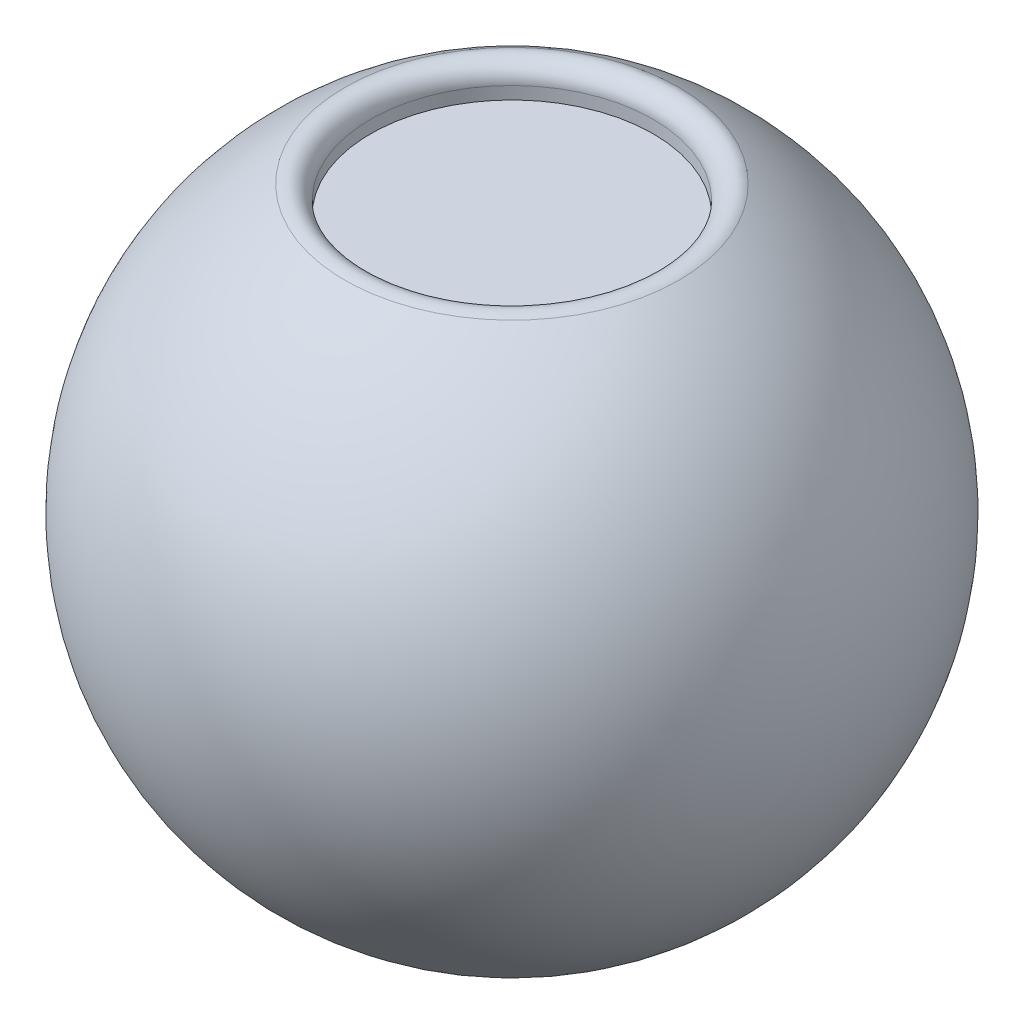
ISO-10303-21;
HEADER;
FILE_DESCRIPTION(('STEP AP214'),'2;1');
FILE_NAME('part.step','',(''),(''),'','','');
FILE_SCHEMA(('AUTOMOTIVE_DESIGN { 1 0 10303 214 1 1 1 1 }'));
ENDSEC;
DATA;
#1=APPLICATION_CONTEXT('core data for automotive mechanical design processes');
#2=APPLICATION_PROTOCOL_DEFINITION('international standard','automotive_design',2000,#1);
#3=PRODUCT_CONTEXT('',#1,'mechanical');
#4=PRODUCT('Part','Part','',(#3));
#5=PRODUCT_RELATED_PRODUCT_CATEGORY('part','',(#4));
#6=PRODUCT_DEFINITION_FORMATION('','',#4);
#7=PRODUCT_DEFINITION_CONTEXT('part definition',#1,'design');
#8=PRODUCT_DEFINITION('design','',#6,#7);
#9=PRODUCT_DEFINITION_SHAPE('','',#8);
#10=(LENGTH_UNIT() NAMED_UNIT(*) SI_UNIT(.MILLI.,.METRE.));
#11=(NAMED_UNIT(*) PLANE_ANGLE_UNIT() SI_UNIT($,.RADIAN.));
#12=(NAMED_UNIT(*) SI_UNIT($,.STERADIAN.) SOLID_ANGLE_UNIT());
#13=UNCERTAINTY_MEASURE_WITH_UNIT(LENGTH_MEASURE(1.E-05),#10,'distance_accuracy_value','');
#14=(GEOMETRIC_REPRESENTATION_CONTEXT(3) GLOBAL_UNCERTAINTY_ASSIGNED_CONTEXT((#13)) GLOBAL_UNIT_ASSIGNED_CONTEXT((#10,
#11,#12)) REPRESENTATION_CONTEXT('',''));
#15=CARTESIAN_POINT('',(0.,0.,0.));
#16=DIRECTION('',(0.,0.,1.));
#17=DIRECTION('',(1.,0.,0.));
#18=AXIS2_PLACEMENT_3D('',#15,#16,#17);
#19=CARTESIAN_POINT('',(38.5,0.,0.));
#20=DIRECTION('',(1.,0.,0.));
#21=DIRECTION('',(0.,1.,0.));
#22=AXIS2_PLACEMENT_3D('',#19,#20,#21);
#23=SPHERICAL_SURFACE('',#22,38.5);
#24=CARTESIAN_POINT('',(38.5,33.1883347845623,0.));
#25=DIRECTION('',(0.,-1.,0.));
#26=DIRECTION('',(0.,0.,-1.));
#27=AXIS2_PLACEMENT_3D('',#24,#25,#26);
#28=CIRCLE('',#27,19.513698630137);
#29=CARTESIAN_POINT('',(38.5,33.1883347845623,-19.513698630137));
#30=VERTEX_POINT('',#29);
#31=EDGE_CURVE('E42',#30,#30,#28,.T.);
#32=ORIENTED_EDGE('',*,*,#31,.T.);
#33=EDGE_LOOP('',(#32));
#34=FACE_BOUND('',#33,.T.);
#35=CARTESIAN_POINT('',(6.7,0.,0.));
#36=DIRECTION('',(1.,0.,0.));
#37=DIRECTION('',(0.,0.,-1.));
#38=AXIS2_PLACEMENT_3D('',#35,#36,#37);
#39=CIRCLE('',#38,21.7027648008267);
#40=CARTESIAN_POINT('',(6.7,0.,-21.7027648008267));
#41=VERTEX_POINT('',#40);
#42=EDGE_CURVE('E46',#41,#41,#39,.F.);
#43=ORIENTED_EDGE('',*,*,#42,.F.);
#44=EDGE_LOOP('',(#43));
#45=FACE_BOUND('',#44,.T.);
#46=ADVANCED_FACE('F35',(#34,#45),#23,.T.);
#47=CARTESIAN_POINT('',(6.7,-38.5,-40.6086852130018));
#48=DIRECTION('',(1.,0.,0.));
#49=DIRECTION('',(0.,0.,-1.));
#50=AXIS2_PLACEMENT_3D('',#47,#48,#49);
#51=PLANE('',#50);
#52=ORIENTED_EDGE('',*,*,#42,.T.);
#53=EDGE_LOOP('',(#52));
#54=FACE_BOUND('',#53,.T.);
#55=ADVANCED_FACE('F60',(#54),#51,.F.);
#56=CARTESIAN_POINT('',(38.5,38.5,0.));
#57=DIRECTION('',(0.,-1.,0.));
#58=DIRECTION('',(0.,0.,-1.));
#59=AXIS2_PLACEMENT_3D('',#56,#57,#58);
#60=CYLINDRICAL_SURFACE('',#59,16.5);
#61=CARTESIAN_POINT('',(38.5,31.4642654451045,0.));
#62=DIRECTION('',(0.,-1.,0.));
#63=DIRECTION('',(0.,0.,-1.));
#64=AXIS2_PLACEMENT_3D('',#61,#62,#63);
#65=CIRCLE('',#64,16.5);
#66=CARTESIAN_POINT('',(38.5,31.4642654451045,-16.5));
#67=VERTEX_POINT('',#66);
#68=EDGE_CURVE('E10',#67,#67,#65,.F.);
#69=ORIENTED_EDGE('',*,*,#68,.T.);
#70=EDGE_LOOP('',(#69));
#71=FACE_BOUND('',#70,.T.);
#72=CARTESIAN_POINT('',(38.5,30.,0.));
#73=DIRECTION('',(0.,1.,0.));
#74=DIRECTION('',(0.,0.,1.));
#75=AXIS2_PLACEMENT_3D('',#72,#73,#74);
#76=CIRCLE('',#75,16.5);
#77=CARTESIAN_POINT('',(38.5,30.,16.5));
#78=VERTEX_POINT('',#77);
#79=EDGE_CURVE('E50',#78,#78,#76,.T.);
#80=ORIENTED_EDGE('',*,*,#79,.F.);
#81=EDGE_LOOP('',(#80));
#82=FACE_BOUND('',#81,.T.);
#83=ADVANCED_FACE('F58',(#71,#82),#60,.F.);
#84=CARTESIAN_POINT('',(38.5,30.,0.));
#85=DIRECTION('',(0.,1.,0.));
#86=DIRECTION('',(0.,0.,1.));
#87=AXIS2_PLACEMENT_3D('',#84,#85,#86);
#88=PLANE('',#87);
#89=ORIENTED_EDGE('',*,*,#79,.T.);
#90=EDGE_LOOP('',(#89));
#91=FACE_BOUND('',#90,.T.);
#92=ADVANCED_FACE('F56',(#91),#88,.T.);
#93=CARTESIAN_POINT('',(38.5,31.4642654451045,0.));
#94=DIRECTION('',(0.,-1.,0.));
#95=DIRECTION('',(0.,0.,-1.));
#96=AXIS2_PLACEMENT_3D('',#93,#94,#95);
#97=TOROIDAL_SURFACE('',#96,18.5,2.);
#98=ORIENTED_EDGE('',*,*,#68,.F.);
#99=EDGE_LOOP('',(#98));
#100=FACE_BOUND('',#99,.T.);
#101=ORIENTED_EDGE('',*,*,#31,.F.);
#102=EDGE_LOOP('',(#101));
#103=FACE_BOUND('',#102,.T.);
#104=ADVANCED_FACE('F37',(#100,#103),#97,.T.);
#105=CLOSED_SHELL('',(#46,#55,#83,#92,#104));
#106=MANIFOLD_SOLID_BREP('B2',#105);
#107=ADVANCED_BREP_SHAPE_REPRESENTATION('',(#18,#106),#14);
#108=SHAPE_DEFINITION_REPRESENTATION(#9,#107);
ENDSEC;
END-ISO-10303-21;
